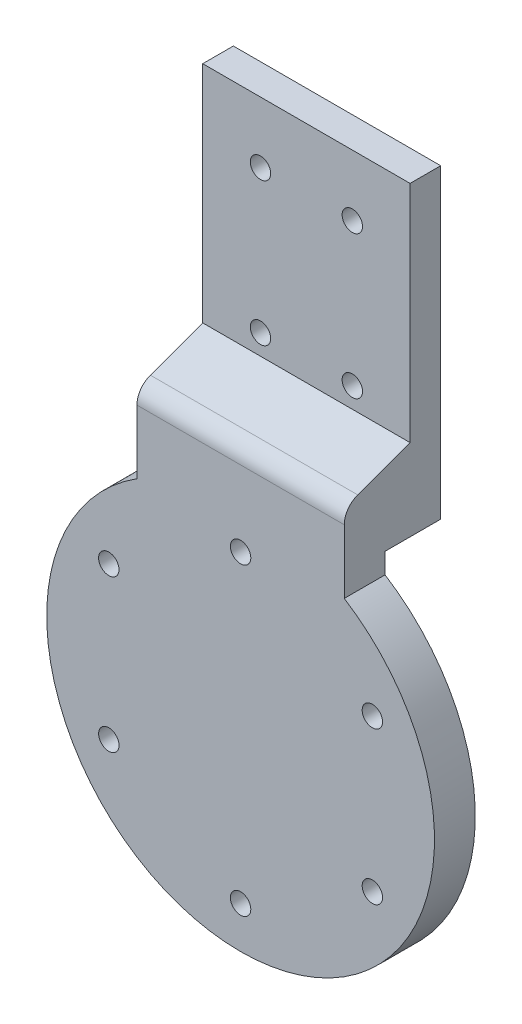
ISO-10303-21;
HEADER;
FILE_DESCRIPTION(('STEP AP214'),'2;1');
FILE_NAME('part.step','',(''),(''),'','','');
FILE_SCHEMA(('AUTOMOTIVE_DESIGN { 1 0 10303 214 1 1 1 1 }'));
ENDSEC;
DATA;
#1=APPLICATION_CONTEXT('core data for automotive mechanical design processes');
#2=APPLICATION_PROTOCOL_DEFINITION('international standard','automotive_design',2000,#1);
#3=PRODUCT_CONTEXT('',#1,'mechanical');
#4=PRODUCT('Part','Part','',(#3));
#5=PRODUCT_RELATED_PRODUCT_CATEGORY('part','',(#4));
#6=PRODUCT_DEFINITION_FORMATION('','',#4);
#7=PRODUCT_DEFINITION_CONTEXT('part definition',#1,'design');
#8=PRODUCT_DEFINITION('design','',#6,#7);
#9=PRODUCT_DEFINITION_SHAPE('','',#8);
#10=(LENGTH_UNIT() NAMED_UNIT(*) SI_UNIT(.MILLI.,.METRE.));
#11=(NAMED_UNIT(*) PLANE_ANGLE_UNIT() SI_UNIT($,.RADIAN.));
#12=(NAMED_UNIT(*) SI_UNIT($,.STERADIAN.) SOLID_ANGLE_UNIT());
#13=UNCERTAINTY_MEASURE_WITH_UNIT(LENGTH_MEASURE(1.E-05),#10,'distance_accuracy_value','');
#14=(GEOMETRIC_REPRESENTATION_CONTEXT(3) GLOBAL_UNCERTAINTY_ASSIGNED_CONTEXT((#13)) GLOBAL_UNIT_ASSIGNED_CONTEXT((#10,
#11,#12)) REPRESENTATION_CONTEXT('',''));
#15=CARTESIAN_POINT('',(0.,0.,0.));
#16=DIRECTION('',(0.,0.,1.));
#17=DIRECTION('',(1.,0.,0.));
#18=AXIS2_PLACEMENT_3D('',#15,#16,#17);
#19=CARTESIAN_POINT('',(-25.4,0.,7.5));
#20=DIRECTION('',(-1.,0.,0.));
#21=DIRECTION('',(0.,0.,1.));
#22=AXIS2_PLACEMENT_3D('',#19,#20,#21);
#23=PLANE('',#22);
#24=DIRECTION('',(0.,-1.,0.));
#25=VECTOR('',#24,1.);
#26=CARTESIAN_POINT('',(-25.4,0.,23.625));
#27=LINE('',#26,#25);
#28=CARTESIAN_POINT('',(-25.4,55.7683278991691,23.625));
#29=VERTEX_POINT('',#28);
#30=CARTESIAN_POINT('',(-25.4,40.13838561776,23.625));
#31=VERTEX_POINT('',#30);
#32=EDGE_CURVE('E208',#29,#31,#27,.T.);
#33=ORIENTED_EDGE('',*,*,#32,.F.);
#34=CARTESIAN_POINT('',(-25.4,55.7683278991691,18.625));
#35=DIRECTION('',(-1.,0.,0.));
#36=DIRECTION('',(0.,0.,1.));
#37=AXIS2_PLACEMENT_3D('',#34,#35,#36);
#38=CIRCLE('',#37,5.);
#39=CARTESIAN_POINT('',(-25.4,60.4667910030987,20.3351007166283));
#40=VERTEX_POINT('',#39);
#41=EDGE_CURVE('E162',#29,#40,#38,.T.);
#42=ORIENTED_EDGE('',*,*,#41,.T.);
#43=DIRECTION('',(0.,-0.342020143325666,0.939692620785909));
#44=VECTOR('',#43,1.);
#45=CARTESIAN_POINT('',(-25.4,65.1383856177602,7.5));
#46=LINE('',#45,#44);
#47=CARTESIAN_POINT('',(-25.4,65.1383856177602,7.5));
#48=VERTEX_POINT('',#47);
#49=EDGE_CURVE('E334',#40,#48,#46,.F.);
#50=ORIENTED_EDGE('',*,*,#49,.T.);
#51=DIRECTION('',(0.,1.,0.));
#52=VECTOR('',#51,1.);
#53=CARTESIAN_POINT('',(-25.4,0.,7.5));
#54=LINE('',#53,#52);
#55=CARTESIAN_POINT('',(-25.4,120.13838565576,7.5));
#56=VERTEX_POINT('',#55);
#57=EDGE_CURVE('E285',#48,#56,#54,.T.);
#58=ORIENTED_EDGE('',*,*,#57,.T.);
#59=DIRECTION('',(0.,0.,-1.));
#60=VECTOR('',#59,1.);
#61=CARTESIAN_POINT('',(-25.4,120.13838565576,7.5));
#62=LINE('',#61,#60);
#63=CARTESIAN_POINT('',(-25.4,120.13838565576,0.));
#64=VERTEX_POINT('',#63);
#65=EDGE_CURVE('E296',#56,#64,#62,.T.);
#66=ORIENTED_EDGE('',*,*,#65,.T.);
#67=DIRECTION('',(0.,1.,0.));
#68=VECTOR('',#67,1.);
#69=CARTESIAN_POINT('',(-25.4,0.,0.));
#70=LINE('',#69,#68);
#71=CARTESIAN_POINT('',(-25.4,45.13838561776,0.));
#72=VERTEX_POINT('',#71);
#73=EDGE_CURVE('E312',#72,#64,#70,.T.);
#74=ORIENTED_EDGE('',*,*,#73,.F.);
#75=DIRECTION('',(0.,0.,-1.));
#76=VECTOR('',#75,1.);
#77=CARTESIAN_POINT('',(-25.4,45.13838561776,13.625));
#78=LINE('',#77,#76);
#79=CARTESIAN_POINT('',(-25.4,45.13838561776,13.625));
#80=VERTEX_POINT('',#79);
#81=EDGE_CURVE('E263',#80,#72,#78,.T.);
#82=ORIENTED_EDGE('',*,*,#81,.F.);
#83=DIRECTION('',(0.,-1.,0.));
#84=VECTOR('',#83,1.);
#85=CARTESIAN_POINT('',(-25.4,0.,13.625));
#86=LINE('',#85,#84);
#87=CARTESIAN_POINT('',(-25.4,40.13838561776,13.625));
#88=VERTEX_POINT('',#87);
#89=EDGE_CURVE('E224',#80,#88,#86,.T.);
#90=ORIENTED_EDGE('',*,*,#89,.T.);
#91=DIRECTION('',(0.,0.,-1.));
#92=VECTOR('',#91,1.);
#93=CARTESIAN_POINT('',(-25.4,40.13838561776,23.625));
#94=LINE('',#93,#92);
#95=EDGE_CURVE('E222',#31,#88,#94,.T.);
#96=ORIENTED_EDGE('',*,*,#95,.F.);
#97=EDGE_LOOP('',(#33,#42,#50,#58,#66,#74,#82,#90,#96));
#98=FACE_BOUND('',#97,.T.);
#99=ADVANCED_FACE('F139',(#98),#23,.T.);
#100=CARTESIAN_POINT('',(25.4,0.,7.5));
#101=DIRECTION('',(1.,0.,0.));
#102=DIRECTION('',(0.,0.,-1.));
#103=AXIS2_PLACEMENT_3D('',#100,#101,#102);
#104=PLANE('',#103);
#105=DIRECTION('',(0.,0.342020143325666,-0.939692620785909));
#106=VECTOR('',#105,1.);
#107=CARTESIAN_POINT('',(25.4,65.1383856177602,7.5));
#108=LINE('',#107,#106);
#109=CARTESIAN_POINT('',(25.4,65.1383856177602,7.5));
#110=VERTEX_POINT('',#109);
#111=CARTESIAN_POINT('',(25.4,60.4667910030987,20.3351007166283));
#112=VERTEX_POINT('',#111);
#113=EDGE_CURVE('E331',#110,#112,#108,.F.);
#114=ORIENTED_EDGE('',*,*,#113,.T.);
#115=CARTESIAN_POINT('',(25.4,55.7683278991691,18.625));
#116=DIRECTION('',(1.,0.,0.));
#117=DIRECTION('',(0.,0.,-1.));
#118=AXIS2_PLACEMENT_3D('',#115,#116,#117);
#119=CIRCLE('',#118,5.);
#120=CARTESIAN_POINT('',(25.4,55.7683278991691,23.625));
#121=VERTEX_POINT('',#120);
#122=EDGE_CURVE('E12',#112,#121,#119,.T.);
#123=ORIENTED_EDGE('',*,*,#122,.T.);
#124=DIRECTION('',(0.,1.,0.));
#125=VECTOR('',#124,1.);
#126=CARTESIAN_POINT('',(25.4,0.,23.625));
#127=LINE('',#126,#125);
#128=CARTESIAN_POINT('',(25.4,40.13838561776,23.625));
#129=VERTEX_POINT('',#128);
#130=EDGE_CURVE('E235',#129,#121,#127,.T.);
#131=ORIENTED_EDGE('',*,*,#130,.F.);
#132=DIRECTION('',(0.,0.,-1.));
#133=VECTOR('',#132,1.);
#134=CARTESIAN_POINT('',(25.4,40.13838561776,23.625));
#135=LINE('',#134,#133);
#136=CARTESIAN_POINT('',(25.4,40.13838561776,13.625));
#137=VERTEX_POINT('',#136);
#138=EDGE_CURVE('E229',#129,#137,#135,.T.);
#139=ORIENTED_EDGE('',*,*,#138,.T.);
#140=DIRECTION('',(0.,1.,0.));
#141=VECTOR('',#140,1.);
#142=CARTESIAN_POINT('',(25.4,0.,13.625));
#143=LINE('',#142,#141);
#144=CARTESIAN_POINT('',(25.4,45.13838561776,13.625));
#145=VERTEX_POINT('',#144);
#146=EDGE_CURVE('E219',#137,#145,#143,.T.);
#147=ORIENTED_EDGE('',*,*,#146,.T.);
#148=DIRECTION('',(0.,0.,-1.));
#149=VECTOR('',#148,1.);
#150=CARTESIAN_POINT('',(25.4,45.13838561776,13.625));
#151=LINE('',#150,#149);
#152=CARTESIAN_POINT('',(25.4,45.13838561776,0.));
#153=VERTEX_POINT('',#152);
#154=EDGE_CURVE('E256',#145,#153,#151,.T.);
#155=ORIENTED_EDGE('',*,*,#154,.T.);
#156=DIRECTION('',(0.,-1.,0.));
#157=VECTOR('',#156,1.);
#158=CARTESIAN_POINT('',(25.4,0.,0.));
#159=LINE('',#158,#157);
#160=CARTESIAN_POINT('',(25.4,120.13838565576,0.));
#161=VERTEX_POINT('',#160);
#162=EDGE_CURVE('E316',#161,#153,#159,.T.);
#163=ORIENTED_EDGE('',*,*,#162,.F.);
#164=DIRECTION('',(0.,0.,-1.));
#165=VECTOR('',#164,1.);
#166=CARTESIAN_POINT('',(25.4,120.13838565576,7.5));
#167=LINE('',#166,#165);
#168=CARTESIAN_POINT('',(25.4,120.13838565576,7.5));
#169=VERTEX_POINT('',#168);
#170=EDGE_CURVE('E324',#169,#161,#167,.T.);
#171=ORIENTED_EDGE('',*,*,#170,.F.);
#172=DIRECTION('',(0.,-1.,0.));
#173=VECTOR('',#172,1.);
#174=CARTESIAN_POINT('',(25.4,0.,7.5));
#175=LINE('',#174,#173);
#176=EDGE_CURVE('E288',#169,#110,#175,.T.);
#177=ORIENTED_EDGE('',*,*,#176,.T.);
#178=EDGE_LOOP('',(#114,#123,#131,#139,#147,#155,#163,#171,#177));
#179=FACE_BOUND('',#178,.T.);
#180=ADVANCED_FACE('F351',(#179),#104,.T.);
#181=CARTESIAN_POINT('',(-11.25,105.13838565576,7.5));
#182=DIRECTION('',(0.,0.,-1.));
#183=DIRECTION('',(-1.,0.,0.));
#184=AXIS2_PLACEMENT_3D('',#181,#182,#183);
#185=CYLINDRICAL_SURFACE('',#184,2.5);
#186=CARTESIAN_POINT('',(-11.25,105.13838565576,7.5));
#187=DIRECTION('',(0.,0.,1.));
#188=DIRECTION('',(1.,0.,0.));
#189=AXIS2_PLACEMENT_3D('',#186,#187,#188);
#190=CIRCLE('',#189,2.5);
#191=CARTESIAN_POINT('',(-8.75,105.13838565576,7.5));
#192=VERTEX_POINT('',#191);
#193=EDGE_CURVE('E281',#192,#192,#190,.T.);
#194=ORIENTED_EDGE('',*,*,#193,.T.);
#195=EDGE_LOOP('',(#194));
#196=FACE_BOUND('',#195,.T.);
#197=CARTESIAN_POINT('',(-11.25,105.13838565576,0.));
#198=DIRECTION('',(0.,0.,1.));
#199=DIRECTION('',(1.,0.,0.));
#200=AXIS2_PLACEMENT_3D('',#197,#198,#199);
#201=CIRCLE('',#200,2.5);
#202=CARTESIAN_POINT('',(-8.75,105.13838565576,0.));
#203=VERTEX_POINT('',#202);
#204=EDGE_CURVE('E308',#203,#203,#201,.T.);
#205=ORIENTED_EDGE('',*,*,#204,.F.);
#206=EDGE_LOOP('',(#205));
#207=FACE_BOUND('',#206,.T.);
#208=ADVANCED_FACE('F364',(#196,#207),#185,.F.);
#209=CARTESIAN_POINT('',(11.25,105.13838565576,7.5));
#210=DIRECTION('',(0.,0.,-1.));
#211=DIRECTION('',(-1.,0.,0.));
#212=AXIS2_PLACEMENT_3D('',#209,#210,#211);
#213=CYLINDRICAL_SURFACE('',#212,2.50000000000001);
#214=CARTESIAN_POINT('',(11.25,105.13838565576,7.5));
#215=DIRECTION('',(0.,0.,1.));
#216=DIRECTION('',(1.,0.,0.));
#217=AXIS2_PLACEMENT_3D('',#214,#215,#216);
#218=CIRCLE('',#217,2.50000000000001);
#219=CARTESIAN_POINT('',(13.75,105.13838565576,7.5));
#220=VERTEX_POINT('',#219);
#221=EDGE_CURVE('E277',#220,#220,#218,.T.);
#222=ORIENTED_EDGE('',*,*,#221,.T.);
#223=EDGE_LOOP('',(#222));
#224=FACE_BOUND('',#223,.T.);
#225=CARTESIAN_POINT('',(11.25,105.13838565576,0.));
#226=DIRECTION('',(0.,0.,1.));
#227=DIRECTION('',(1.,0.,0.));
#228=AXIS2_PLACEMENT_3D('',#225,#226,#227);
#229=CIRCLE('',#228,2.50000000000001);
#230=CARTESIAN_POINT('',(13.75,105.13838565576,0.));
#231=VERTEX_POINT('',#230);
#232=EDGE_CURVE('E304',#231,#231,#229,.T.);
#233=ORIENTED_EDGE('',*,*,#232,.F.);
#234=EDGE_LOOP('',(#233));
#235=FACE_BOUND('',#234,.T.);
#236=ADVANCED_FACE('F370',(#224,#235),#213,.F.);
#237=CARTESIAN_POINT('',(11.25,70.13838565576,7.5));
#238=DIRECTION('',(0.,0.,-1.));
#239=DIRECTION('',(-1.,0.,0.));
#240=AXIS2_PLACEMENT_3D('',#237,#238,#239);
#241=CYLINDRICAL_SURFACE('',#240,2.5);
#242=CARTESIAN_POINT('',(11.25,70.13838565576,7.5));
#243=DIRECTION('',(0.,0.,1.));
#244=DIRECTION('',(1.,0.,0.));
#245=AXIS2_PLACEMENT_3D('',#242,#243,#244);
#246=CIRCLE('',#245,2.5);
#247=CARTESIAN_POINT('',(13.75,70.13838565576,7.5));
#248=VERTEX_POINT('',#247);
#249=EDGE_CURVE('E272',#248,#248,#246,.T.);
#250=ORIENTED_EDGE('',*,*,#249,.T.);
#251=EDGE_LOOP('',(#250));
#252=FACE_BOUND('',#251,.T.);
#253=CARTESIAN_POINT('',(11.25,70.13838565576,0.));
#254=DIRECTION('',(0.,0.,1.));
#255=DIRECTION('',(1.,0.,0.));
#256=AXIS2_PLACEMENT_3D('',#253,#254,#255);
#257=CIRCLE('',#256,2.5);
#258=CARTESIAN_POINT('',(13.75,70.13838565576,0.));
#259=VERTEX_POINT('',#258);
#260=EDGE_CURVE('E300',#259,#259,#257,.T.);
#261=ORIENTED_EDGE('',*,*,#260,.F.);
#262=EDGE_LOOP('',(#261));
#263=FACE_BOUND('',#262,.T.);
#264=ADVANCED_FACE('F374',(#252,#263),#241,.F.);
#265=CARTESIAN_POINT('',(-11.25,70.13838565576,7.5));
#266=DIRECTION('',(0.,0.,-1.));
#267=DIRECTION('',(-1.,0.,0.));
#268=AXIS2_PLACEMENT_3D('',#265,#266,#267);
#269=CYLINDRICAL_SURFACE('',#268,2.50000000000001);
#270=CARTESIAN_POINT('',(-11.25,70.13838565576,7.5));
#271=DIRECTION('',(0.,0.,1.));
#272=DIRECTION('',(1.,0.,0.));
#273=AXIS2_PLACEMENT_3D('',#270,#271,#272);
#274=CIRCLE('',#273,2.50000000000001);
#275=CARTESIAN_POINT('',(-8.75,70.13838565576,7.5));
#276=VERTEX_POINT('',#275);
#277=EDGE_CURVE('E268',#276,#276,#274,.T.);
#278=ORIENTED_EDGE('',*,*,#277,.T.);
#279=EDGE_LOOP('',(#278));
#280=FACE_BOUND('',#279,.T.);
#281=CARTESIAN_POINT('',(-11.25,70.13838565576,0.));
#282=DIRECTION('',(0.,0.,1.));
#283=DIRECTION('',(1.,0.,0.));
#284=AXIS2_PLACEMENT_3D('',#281,#282,#283);
#285=CIRCLE('',#284,2.50000000000001);
#286=CARTESIAN_POINT('',(-8.75,70.13838565576,0.));
#287=VERTEX_POINT('',#286);
#288=EDGE_CURVE('E267',#287,#287,#285,.T.);
#289=ORIENTED_EDGE('',*,*,#288,.F.);
#290=EDGE_LOOP('',(#289));
#291=FACE_BOUND('',#290,.T.);
#292=ADVANCED_FACE('F378',(#280,#291),#269,.F.);
#293=CARTESIAN_POINT('',(0.,120.13838565576,7.5));
#294=DIRECTION('',(0.,1.,0.));
#295=DIRECTION('',(0.,0.,1.));
#296=AXIS2_PLACEMENT_3D('',#293,#294,#295);
#297=PLANE('',#296);
#298=DIRECTION('',(1.,0.,0.));
#299=VECTOR('',#298,1.);
#300=CARTESIAN_POINT('',(0.,120.13838565576,0.));
#301=LINE('',#300,#299);
#302=EDGE_CURVE('E273',#64,#161,#301,.T.);
#303=ORIENTED_EDGE('',*,*,#302,.F.);
#304=ORIENTED_EDGE('',*,*,#65,.F.);
#305=DIRECTION('',(1.,0.,0.));
#306=VECTOR('',#305,1.);
#307=CARTESIAN_POINT('',(0.,120.13838565576,7.5));
#308=LINE('',#307,#306);
#309=EDGE_CURVE('E292',#56,#169,#308,.T.);
#310=ORIENTED_EDGE('',*,*,#309,.T.);
#311=ORIENTED_EDGE('',*,*,#170,.T.);
#312=EDGE_LOOP('',(#303,#304,#310,#311));
#313=FACE_BOUND('',#312,.T.);
#314=ADVANCED_FACE('F381',(#313),#297,.T.);
#315=CARTESIAN_POINT('',(0.,0.,7.5));
#316=DIRECTION('',(0.,0.,1.));
#317=DIRECTION('',(1.,0.,0.));
#318=AXIS2_PLACEMENT_3D('',#315,#316,#317);
#319=PLANE('',#318);
#320=ORIENTED_EDGE('',*,*,#277,.F.);
#321=EDGE_LOOP('',(#320));
#322=FACE_BOUND('',#321,.T.);
#323=ORIENTED_EDGE('',*,*,#249,.F.);
#324=EDGE_LOOP('',(#323));
#325=FACE_BOUND('',#324,.T.);
#326=ORIENTED_EDGE('',*,*,#221,.F.);
#327=EDGE_LOOP('',(#326));
#328=FACE_BOUND('',#327,.T.);
#329=ORIENTED_EDGE('',*,*,#193,.F.);
#330=EDGE_LOOP('',(#329));
#331=FACE_BOUND('',#330,.T.);
#332=ORIENTED_EDGE('',*,*,#57,.F.);
#333=DIRECTION('',(1.,0.,0.));
#334=VECTOR('',#333,1.);
#335=CARTESIAN_POINT('',(25.4,65.1383856177602,7.5));
#336=LINE('',#335,#334);
#337=EDGE_CURVE('E327',#48,#110,#336,.T.);
#338=ORIENTED_EDGE('',*,*,#337,.T.);
#339=ORIENTED_EDGE('',*,*,#176,.F.);
#340=ORIENTED_EDGE('',*,*,#309,.F.);
#341=EDGE_LOOP('',(#332,#338,#339,#340));
#342=FACE_BOUND('',#341,.T.);
#343=ADVANCED_FACE('F346',(#322,#325,#328,#331,#342),#319,.T.);
#344=CARTESIAN_POINT('',(0.,0.,0.));
#345=DIRECTION('',(0.,0.,1.));
#346=DIRECTION('',(1.,0.,0.));
#347=AXIS2_PLACEMENT_3D('',#344,#345,#346);
#348=PLANE('',#347);
#349=ORIENTED_EDGE('',*,*,#288,.T.);
#350=EDGE_LOOP('',(#349));
#351=FACE_BOUND('',#350,.T.);
#352=ORIENTED_EDGE('',*,*,#260,.T.);
#353=EDGE_LOOP('',(#352));
#354=FACE_BOUND('',#353,.T.);
#355=ORIENTED_EDGE('',*,*,#232,.T.);
#356=EDGE_LOOP('',(#355));
#357=FACE_BOUND('',#356,.T.);
#358=ORIENTED_EDGE('',*,*,#204,.T.);
#359=EDGE_LOOP('',(#358));
#360=FACE_BOUND('',#359,.T.);
#361=ORIENTED_EDGE('',*,*,#73,.T.);
#362=ORIENTED_EDGE('',*,*,#302,.T.);
#363=ORIENTED_EDGE('',*,*,#162,.T.);
#364=DIRECTION('',(1.,0.,0.));
#365=VECTOR('',#364,1.);
#366=CARTESIAN_POINT('',(0.,45.13838561776,0.));
#367=LINE('',#366,#365);
#368=EDGE_CURVE('E228',#72,#153,#367,.T.);
#369=ORIENTED_EDGE('',*,*,#368,.F.);
#370=EDGE_LOOP('',(#361,#362,#363,#369));
#371=FACE_BOUND('',#370,.T.);
#372=ADVANCED_FACE('F394',(#351,#354,#357,#360,#371),#348,.F.);
#373=CARTESIAN_POINT('',(0.,45.13838561776,13.625));
#374=DIRECTION('',(0.,1.,0.));
#375=DIRECTION('',(0.,0.,1.));
#376=AXIS2_PLACEMENT_3D('',#373,#374,#375);
#377=PLANE('',#376);
#378=ORIENTED_EDGE('',*,*,#368,.T.);
#379=ORIENTED_EDGE('',*,*,#154,.F.);
#380=DIRECTION('',(1.,0.,0.));
#381=VECTOR('',#380,1.);
#382=CARTESIAN_POINT('',(0.,45.13838561776,13.625));
#383=LINE('',#382,#381);
#384=EDGE_CURVE('E252',#80,#145,#383,.T.);
#385=ORIENTED_EDGE('',*,*,#384,.F.);
#386=ORIENTED_EDGE('',*,*,#81,.T.);
#387=EDGE_LOOP('',(#378,#379,#385,#386));
#388=FACE_BOUND('',#387,.T.);
#389=ADVANCED_FACE('F397',(#388),#377,.F.);
#390=CARTESIAN_POINT('',(0.,0.,13.625));
#391=DIRECTION('',(0.,0.,1.));
#392=DIRECTION('',(1.,0.,0.));
#393=AXIS2_PLACEMENT_3D('',#390,#391,#392);
#394=PLANE('',#393);
#395=CARTESIAN_POINT('',(0.,37.28,13.625));
#396=DIRECTION('',(0.,0.,1.));
#397=DIRECTION('',(1.,0.,0.));
#398=AXIS2_PLACEMENT_3D('',#395,#396,#397);
#399=CIRCLE('',#398,2.5);
#400=CARTESIAN_POINT('',(2.5,37.28,13.625));
#401=VERTEX_POINT('',#400);
#402=EDGE_CURVE('E604',#401,#401,#399,.T.);
#403=ORIENTED_EDGE('',*,*,#402,.T.);
#404=EDGE_LOOP('',(#403));
#405=FACE_BOUND('',#404,.T.);
#406=CARTESIAN_POINT('',(32.2854270530839,18.64,13.625));
#407=DIRECTION('',(0.,0.,1.));
#408=DIRECTION('',(1.,0.,0.));
#409=AXIS2_PLACEMENT_3D('',#406,#407,#408);
#410=CIRCLE('',#409,2.49999999999999);
#411=CARTESIAN_POINT('',(34.7854270530839,18.64,13.625));
#412=VERTEX_POINT('',#411);
#413=EDGE_CURVE('E611',#412,#412,#410,.T.);
#414=ORIENTED_EDGE('',*,*,#413,.T.);
#415=EDGE_LOOP('',(#414));
#416=FACE_BOUND('',#415,.T.);
#417=CARTESIAN_POINT('',(32.2854270530839,-18.64,13.625));
#418=DIRECTION('',(0.,0.,1.));
#419=DIRECTION('',(1.,0.,0.));
#420=AXIS2_PLACEMENT_3D('',#417,#418,#419);
#421=CIRCLE('',#420,2.49999999999999);
#422=CARTESIAN_POINT('',(34.7854270530839,-18.64,13.625));
#423=VERTEX_POINT('',#422);
#424=EDGE_CURVE('E618',#423,#423,#421,.T.);
#425=ORIENTED_EDGE('',*,*,#424,.T.);
#426=EDGE_LOOP('',(#425));
#427=FACE_BOUND('',#426,.T.);
#428=CARTESIAN_POINT('',(0.,-37.28,13.625));
#429=DIRECTION('',(0.,0.,1.));
#430=DIRECTION('',(1.,0.,0.));
#431=AXIS2_PLACEMENT_3D('',#428,#429,#430);
#432=CIRCLE('',#431,2.5);
#433=CARTESIAN_POINT('',(2.5,-37.28,13.625));
#434=VERTEX_POINT('',#433);
#435=EDGE_CURVE('E626',#434,#434,#432,.T.);
#436=ORIENTED_EDGE('',*,*,#435,.T.);
#437=EDGE_LOOP('',(#436));
#438=FACE_BOUND('',#437,.T.);
#439=CARTESIAN_POINT('',(-32.2854270530839,-18.64,13.625));
#440=DIRECTION('',(0.,0.,1.));
#441=DIRECTION('',(1.,0.,0.));
#442=AXIS2_PLACEMENT_3D('',#439,#440,#441);
#443=CIRCLE('',#442,2.5);
#444=CARTESIAN_POINT('',(-29.7854270530839,-18.64,13.625));
#445=VERTEX_POINT('',#444);
#446=EDGE_CURVE('E634',#445,#445,#443,.T.);
#447=ORIENTED_EDGE('',*,*,#446,.T.);
#448=EDGE_LOOP('',(#447));
#449=FACE_BOUND('',#448,.T.);
#450=CARTESIAN_POINT('',(-32.2854270530839,18.64,13.625));
#451=DIRECTION('',(0.,0.,1.));
#452=DIRECTION('',(1.,0.,0.));
#453=AXIS2_PLACEMENT_3D('',#450,#451,#452);
#454=CIRCLE('',#453,2.5);
#455=CARTESIAN_POINT('',(-29.7854270530839,18.64,13.625));
#456=VERTEX_POINT('',#455);
#457=EDGE_CURVE('E642',#456,#456,#454,.T.);
#458=ORIENTED_EDGE('',*,*,#457,.T.);
#459=EDGE_LOOP('',(#458));
#460=FACE_BOUND('',#459,.T.);
#461=ORIENTED_EDGE('',*,*,#89,.F.);
#462=ORIENTED_EDGE('',*,*,#384,.T.);
#463=ORIENTED_EDGE('',*,*,#146,.F.);
#464=CARTESIAN_POINT('',(0.,0.,13.625));
#465=DIRECTION('',(0.,0.,1.));
#466=DIRECTION('',(1.,0.,0.));
#467=AXIS2_PLACEMENT_3D('',#464,#465,#466);
#468=CIRCLE('',#467,47.5);
#469=EDGE_CURVE('E243',#88,#137,#468,.T.);
#470=ORIENTED_EDGE('',*,*,#469,.F.);
#471=EDGE_LOOP('',(#461,#462,#463,#470));
#472=FACE_BOUND('',#471,.T.);
#473=ADVANCED_FACE('F412',(#405,#416,#427,#438,#449,#460,#472),#394,.F.);
#474=CARTESIAN_POINT('',(0.,0.,23.625));
#475=DIRECTION('',(0.,0.,1.));
#476=DIRECTION('',(1.,0.,0.));
#477=AXIS2_PLACEMENT_3D('',#474,#475,#476);
#478=PLANE('',#477);
#479=CARTESIAN_POINT('',(-32.2854270530839,-18.64,23.625));
#480=DIRECTION('',(0.,0.,1.));
#481=DIRECTION('',(1.,0.,0.));
#482=AXIS2_PLACEMENT_3D('',#479,#480,#481);
#483=CIRCLE('',#482,2.5);
#484=CARTESIAN_POINT('',(-29.7854270530839,-18.64,23.625));
#485=VERTEX_POINT('',#484);
#486=EDGE_CURVE('E630',#485,#485,#483,.T.);
#487=ORIENTED_EDGE('',*,*,#486,.F.);
#488=EDGE_LOOP('',(#487));
#489=FACE_BOUND('',#488,.T.);
#490=CARTESIAN_POINT('',(32.2854270530839,-18.64,23.625));
#491=DIRECTION('',(0.,0.,1.));
#492=DIRECTION('',(1.,0.,0.));
#493=AXIS2_PLACEMENT_3D('',#490,#491,#492);
#494=CIRCLE('',#493,2.49999999999999);
#495=CARTESIAN_POINT('',(34.7854270530839,-18.64,23.625));
#496=VERTEX_POINT('',#495);
#497=EDGE_CURVE('E616',#496,#496,#494,.T.);
#498=ORIENTED_EDGE('',*,*,#497,.F.);
#499=EDGE_LOOP('',(#498));
#500=FACE_BOUND('',#499,.T.);
#501=CARTESIAN_POINT('',(0.,37.28,23.625));
#502=DIRECTION('',(0.,0.,1.));
#503=DIRECTION('',(1.,0.,0.));
#504=AXIS2_PLACEMENT_3D('',#501,#502,#503);
#505=CIRCLE('',#504,2.5);
#506=CARTESIAN_POINT('',(2.5,37.28,23.625));
#507=VERTEX_POINT('',#506);
#508=EDGE_CURVE('E244',#507,#507,#505,.T.);
#509=ORIENTED_EDGE('',*,*,#508,.F.);
#510=EDGE_LOOP('',(#509));
#511=FACE_BOUND('',#510,.T.);
#512=ORIENTED_EDGE('',*,*,#130,.T.);
#513=DIRECTION('',(1.,0.,0.));
#514=VECTOR('',#513,1.);
#515=CARTESIAN_POINT('',(-25.4,55.7683278991691,23.625));
#516=LINE('',#515,#514);
#517=EDGE_CURVE('E217',#121,#29,#516,.F.);
#518=ORIENTED_EDGE('',*,*,#517,.T.);
#519=ORIENTED_EDGE('',*,*,#32,.T.);
#520=CARTESIAN_POINT('',(0.,0.,23.625));
#521=DIRECTION('',(0.,0.,1.));
#522=DIRECTION('',(1.,0.,0.));
#523=AXIS2_PLACEMENT_3D('',#520,#521,#522);
#524=CIRCLE('',#523,47.5);
#525=EDGE_CURVE('E214',#31,#129,#524,.T.);
#526=ORIENTED_EDGE('',*,*,#525,.T.);
#527=EDGE_LOOP('',(#512,#518,#519,#526));
#528=FACE_BOUND('',#527,.T.);
#529=CARTESIAN_POINT('',(32.2854270530839,18.64,23.625));
#530=DIRECTION('',(0.,0.,1.));
#531=DIRECTION('',(1.,0.,0.));
#532=AXIS2_PLACEMENT_3D('',#529,#530,#531);
#533=CIRCLE('',#532,2.49999999999999);
#534=CARTESIAN_POINT('',(34.7854270530839,18.64,23.625));
#535=VERTEX_POINT('',#534);
#536=EDGE_CURVE('E606',#535,#535,#533,.T.);
#537=ORIENTED_EDGE('',*,*,#536,.F.);
#538=EDGE_LOOP('',(#537));
#539=FACE_BOUND('',#538,.T.);
#540=CARTESIAN_POINT('',(0.,-37.28,23.625));
#541=DIRECTION('',(0.,0.,1.));
#542=DIRECTION('',(1.,0.,0.));
#543=AXIS2_PLACEMENT_3D('',#540,#541,#542);
#544=CIRCLE('',#543,2.5);
#545=CARTESIAN_POINT('',(2.5,-37.28,23.625));
#546=VERTEX_POINT('',#545);
#547=EDGE_CURVE('E622',#546,#546,#544,.T.);
#548=ORIENTED_EDGE('',*,*,#547,.F.);
#549=EDGE_LOOP('',(#548));
#550=FACE_BOUND('',#549,.T.);
#551=CARTESIAN_POINT('',(-32.2854270530839,18.64,23.625));
#552=DIRECTION('',(0.,0.,1.));
#553=DIRECTION('',(1.,0.,0.));
#554=AXIS2_PLACEMENT_3D('',#551,#552,#553);
#555=CIRCLE('',#554,2.5);
#556=CARTESIAN_POINT('',(-29.7854270530839,18.64,23.625));
#557=VERTEX_POINT('',#556);
#558=EDGE_CURVE('E638',#557,#557,#555,.T.);
#559=ORIENTED_EDGE('',*,*,#558,.F.);
#560=EDGE_LOOP('',(#559));
#561=FACE_BOUND('',#560,.T.);
#562=ADVANCED_FACE('F211',(#489,#500,#511,#528,#539,#550,#561),#478,.T.);
#563=CARTESIAN_POINT('',(0.,0.,23.625));
#564=DIRECTION('',(0.,0.,-1.));
#565=DIRECTION('',(-1.,0.,0.));
#566=AXIS2_PLACEMENT_3D('',#563,#564,#565);
#567=CYLINDRICAL_SURFACE('',#566,47.5);
#568=ORIENTED_EDGE('',*,*,#469,.T.);
#569=ORIENTED_EDGE('',*,*,#138,.F.);
#570=ORIENTED_EDGE('',*,*,#525,.F.);
#571=ORIENTED_EDGE('',*,*,#95,.T.);
#572=EDGE_LOOP('',(#568,#569,#570,#571));
#573=FACE_BOUND('',#572,.T.);
#574=ADVANCED_FACE('F231',(#573),#567,.T.);
#575=CARTESIAN_POINT('',(0.,37.28,23.625));
#576=DIRECTION('',(0.,0.,-1.));
#577=DIRECTION('',(-1.,0.,0.));
#578=AXIS2_PLACEMENT_3D('',#575,#576,#577);
#579=CYLINDRICAL_SURFACE('',#578,2.5);
#580=ORIENTED_EDGE('',*,*,#508,.T.);
#581=EDGE_LOOP('',(#580));
#582=FACE_BOUND('',#581,.T.);
#583=ORIENTED_EDGE('',*,*,#402,.F.);
#584=EDGE_LOOP('',(#583));
#585=FACE_BOUND('',#584,.T.);
#586=ADVANCED_FACE('F428',(#582,#585),#579,.F.);
#587=CARTESIAN_POINT('',(32.2854270530839,18.64,23.625));
#588=DIRECTION('',(0.,0.,-1.));
#589=DIRECTION('',(-1.,0.,0.));
#590=AXIS2_PLACEMENT_3D('',#587,#588,#589);
#591=CYLINDRICAL_SURFACE('',#590,2.49999999999999);
#592=ORIENTED_EDGE('',*,*,#536,.T.);
#593=EDGE_LOOP('',(#592));
#594=FACE_BOUND('',#593,.T.);
#595=ORIENTED_EDGE('',*,*,#413,.F.);
#596=EDGE_LOOP('',(#595));
#597=FACE_BOUND('',#596,.T.);
#598=ADVANCED_FACE('F479',(#594,#597),#591,.F.);
#599=CARTESIAN_POINT('',(32.2854270530839,-18.64,23.625));
#600=DIRECTION('',(0.,0.,-1.));
#601=DIRECTION('',(-1.,0.,0.));
#602=AXIS2_PLACEMENT_3D('',#599,#600,#601);
#603=CYLINDRICAL_SURFACE('',#602,2.49999999999999);
#604=ORIENTED_EDGE('',*,*,#497,.T.);
#605=EDGE_LOOP('',(#604));
#606=FACE_BOUND('',#605,.T.);
#607=ORIENTED_EDGE('',*,*,#424,.F.);
#608=EDGE_LOOP('',(#607));
#609=FACE_BOUND('',#608,.T.);
#610=ADVANCED_FACE('F470',(#606,#609),#603,.F.);
#611=CARTESIAN_POINT('',(0.,-37.28,23.625));
#612=DIRECTION('',(0.,0.,-1.));
#613=DIRECTION('',(-1.,0.,0.));
#614=AXIS2_PLACEMENT_3D('',#611,#612,#613);
#615=CYLINDRICAL_SURFACE('',#614,2.5);
#616=ORIENTED_EDGE('',*,*,#547,.T.);
#617=EDGE_LOOP('',(#616));
#618=FACE_BOUND('',#617,.T.);
#619=ORIENTED_EDGE('',*,*,#435,.F.);
#620=EDGE_LOOP('',(#619));
#621=FACE_BOUND('',#620,.T.);
#622=ADVANCED_FACE('F461',(#618,#621),#615,.F.);
#623=CARTESIAN_POINT('',(-32.2854270530839,-18.64,23.625));
#624=DIRECTION('',(0.,0.,-1.));
#625=DIRECTION('',(-1.,0.,0.));
#626=AXIS2_PLACEMENT_3D('',#623,#624,#625);
#627=CYLINDRICAL_SURFACE('',#626,2.5);
#628=ORIENTED_EDGE('',*,*,#486,.T.);
#629=EDGE_LOOP('',(#628));
#630=FACE_BOUND('',#629,.T.);
#631=ORIENTED_EDGE('',*,*,#446,.F.);
#632=EDGE_LOOP('',(#631));
#633=FACE_BOUND('',#632,.T.);
#634=ADVANCED_FACE('F451',(#630,#633),#627,.F.);
#635=CARTESIAN_POINT('',(-32.2854270530839,18.64,23.625));
#636=DIRECTION('',(0.,0.,-1.));
#637=DIRECTION('',(-1.,0.,0.));
#638=AXIS2_PLACEMENT_3D('',#635,#636,#637);
#639=CYLINDRICAL_SURFACE('',#638,2.5);
#640=ORIENTED_EDGE('',*,*,#558,.T.);
#641=EDGE_LOOP('',(#640));
#642=FACE_BOUND('',#641,.T.);
#643=ORIENTED_EDGE('',*,*,#457,.F.);
#644=EDGE_LOOP('',(#643));
#645=FACE_BOUND('',#644,.T.);
#646=ADVANCED_FACE('F357',(#642,#645),#639,.F.);
#647=CARTESIAN_POINT('',(0.,65.1383856177602,7.5));
#648=DIRECTION('',(0.,0.939692620785909,0.342020143325666));
#649=DIRECTION('',(-1.,0.,0.));
#650=AXIS2_PLACEMENT_3D('',#647,#648,#649);
#651=PLANE('',#650);
#652=ORIENTED_EDGE('',*,*,#49,.F.);
#653=DIRECTION('',(-1.,0.,0.));
#654=VECTOR('',#653,1.);
#655=CARTESIAN_POINT('',(25.4,60.4667910030987,20.3351007166283));
#656=LINE('',#655,#654);
#657=EDGE_CURVE('E148',#40,#112,#656,.F.);
#658=ORIENTED_EDGE('',*,*,#657,.T.);
#659=ORIENTED_EDGE('',*,*,#113,.F.);
#660=ORIENTED_EDGE('',*,*,#337,.F.);
#661=EDGE_LOOP('',(#652,#658,#659,#660));
#662=FACE_BOUND('',#661,.T.);
#663=ADVANCED_FACE('F348',(#662),#651,.T.);
#664=CARTESIAN_POINT('',(0.,55.7683278991691,18.625));
#665=DIRECTION('',(-1.,0.,0.));
#666=DIRECTION('',(0.,0.,1.));
#667=AXIS2_PLACEMENT_3D('',#664,#665,#666);
#668=CYLINDRICAL_SURFACE('',#667,5.);
#669=ORIENTED_EDGE('',*,*,#122,.F.);
#670=ORIENTED_EDGE('',*,*,#657,.F.);
#671=ORIENTED_EDGE('',*,*,#41,.F.);
#672=ORIENTED_EDGE('',*,*,#517,.F.);
#673=EDGE_LOOP('',(#669,#670,#671,#672));
#674=FACE_BOUND('',#673,.T.);
#675=ADVANCED_FACE('F141',(#674),#668,.T.);
#676=CLOSED_SHELL('',(#99,#180,#208,#236,#264,#292,#314,#343,#372,#389,#473,#562,#574,#586,#598,
#610,#622,#634,#646,#663,#675));
#677=MANIFOLD_SOLID_BREP('B2',#676);
#678=ADVANCED_BREP_SHAPE_REPRESENTATION('',(#18,#677),#14);
#679=SHAPE_DEFINITION_REPRESENTATION(#9,#678);
ENDSEC;
END-ISO-10303-21;
